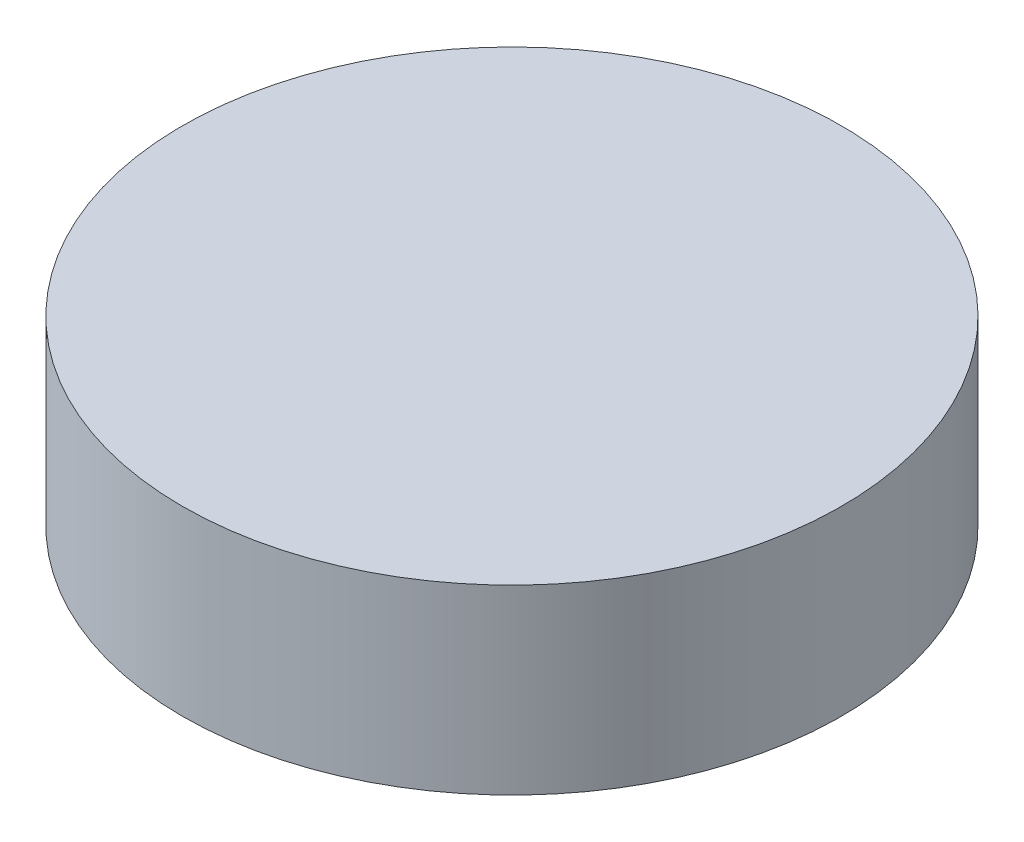
ISO-10303-21;
HEADER;
FILE_DESCRIPTION(('STEP AP214'),'2;1');
FILE_NAME('part.step','',(''),(''),'','','');
FILE_SCHEMA(('AUTOMOTIVE_DESIGN { 1 0 10303 214 1 1 1 1 }'));
ENDSEC;
DATA;
#1=APPLICATION_CONTEXT('core data for automotive mechanical design processes');
#2=APPLICATION_PROTOCOL_DEFINITION('international standard','automotive_design',2000,#1);
#3=PRODUCT_CONTEXT('',#1,'mechanical');
#4=PRODUCT('Part','Part','',(#3));
#5=PRODUCT_RELATED_PRODUCT_CATEGORY('part','',(#4));
#6=PRODUCT_DEFINITION_FORMATION('','',#4);
#7=PRODUCT_DEFINITION_CONTEXT('part definition',#1,'design');
#8=PRODUCT_DEFINITION('design','',#6,#7);
#9=PRODUCT_DEFINITION_SHAPE('','',#8);
#10=(LENGTH_UNIT() NAMED_UNIT(*) SI_UNIT(.MILLI.,.METRE.));
#11=(NAMED_UNIT(*) PLANE_ANGLE_UNIT() SI_UNIT($,.RADIAN.));
#12=(NAMED_UNIT(*) SI_UNIT($,.STERADIAN.) SOLID_ANGLE_UNIT());
#13=UNCERTAINTY_MEASURE_WITH_UNIT(LENGTH_MEASURE(1.E-05),#10,'distance_accuracy_value','');
#14=(GEOMETRIC_REPRESENTATION_CONTEXT(3) GLOBAL_UNCERTAINTY_ASSIGNED_CONTEXT((#13)) GLOBAL_UNIT_ASSIGNED_CONTEXT((#10,
#11,#12)) REPRESENTATION_CONTEXT('',''));
#15=CARTESIAN_POINT('',(0.,0.,0.));
#16=DIRECTION('',(0.,0.,1.));
#17=DIRECTION('',(1.,0.,0.));
#18=AXIS2_PLACEMENT_3D('',#15,#16,#17);
#19=CARTESIAN_POINT('',(-1.35906571700553,20.32,-0.515873220379952));
#20=DIRECTION('',(0.,-1.,0.));
#21=DIRECTION('',(0.,0.,-1.));
#22=AXIS2_PLACEMENT_3D('',#19,#20,#21);
#23=CYLINDRICAL_SURFACE('',#22,36.83);
#24=CARTESIAN_POINT('',(-1.35906571700553,20.32,-0.515873220379952));
#25=DIRECTION('',(0.,1.,0.));
#26=DIRECTION('',(0.,0.,1.));
#27=AXIS2_PLACEMENT_3D('',#24,#25,#26);
#28=CIRCLE('',#27,36.83);
#29=CARTESIAN_POINT('',(-1.35906571700553,20.32,36.3141267796201));
#30=VERTEX_POINT('',#29);
#31=EDGE_CURVE('E10',#30,#30,#28,.T.);
#32=ORIENTED_EDGE('',*,*,#31,.F.);
#33=EDGE_LOOP('',(#32));
#34=FACE_BOUND('',#33,.T.);
#35=CARTESIAN_POINT('',(-1.35906571700553,0.,-0.515873220379952));
#36=DIRECTION('',(0.,1.,0.));
#37=DIRECTION('',(0.,0.,1.));
#38=AXIS2_PLACEMENT_3D('',#35,#36,#37);
#39=CIRCLE('',#38,36.83);
#40=CARTESIAN_POINT('',(-1.35906571700553,0.,36.3141267796201));
#41=VERTEX_POINT('',#40);
#42=EDGE_CURVE('E34',#41,#41,#39,.T.);
#43=ORIENTED_EDGE('',*,*,#42,.T.);
#44=EDGE_LOOP('',(#43));
#45=FACE_BOUND('',#44,.T.);
#46=ADVANCED_FACE('F31',(#34,#45),#23,.T.);
#47=CARTESIAN_POINT('',(-1.35906571700553,20.32,-0.515873220379952));
#48=DIRECTION('',(0.,1.,0.));
#49=DIRECTION('',(0.,0.,1.));
#50=AXIS2_PLACEMENT_3D('',#47,#48,#49);
#51=PLANE('',#50);
#52=ORIENTED_EDGE('',*,*,#31,.T.);
#53=EDGE_LOOP('',(#52));
#54=FACE_BOUND('',#53,.T.);
#55=ADVANCED_FACE('F46',(#54),#51,.T.);
#56=CARTESIAN_POINT('',(-1.35906571700553,0.,-0.515873220379952));
#57=DIRECTION('',(0.,1.,0.));
#58=DIRECTION('',(0.,0.,1.));
#59=AXIS2_PLACEMENT_3D('',#56,#57,#58);
#60=PLANE('',#59);
#61=ORIENTED_EDGE('',*,*,#42,.F.);
#62=EDGE_LOOP('',(#61));
#63=FACE_BOUND('',#62,.T.);
#64=ADVANCED_FACE('F44',(#63),#60,.F.);
#65=CLOSED_SHELL('',(#46,#55,#64));
#66=MANIFOLD_SOLID_BREP('B2',#65);
#67=ADVANCED_BREP_SHAPE_REPRESENTATION('',(#18,#66),#14);
#68=SHAPE_DEFINITION_REPRESENTATION(#9,#67);
ENDSEC;
END-ISO-10303-21;
